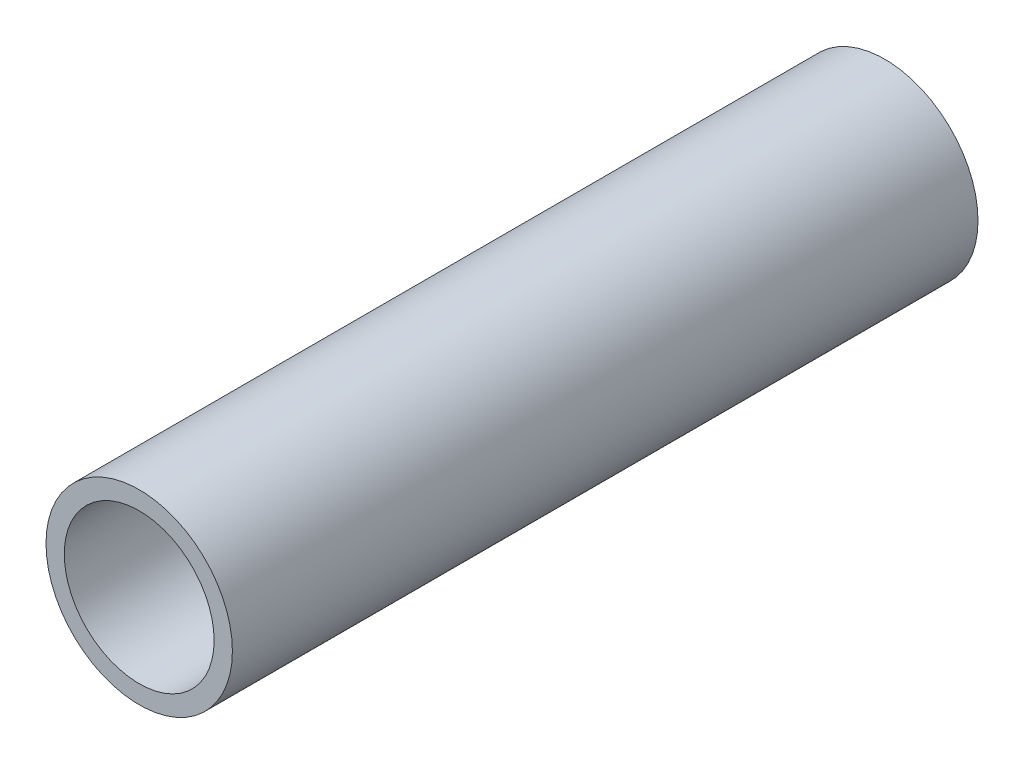
ISO-10303-21;
HEADER;
FILE_DESCRIPTION(('STEP AP214'),'2;1');
FILE_NAME('part.step','',(''),(''),'','','');
FILE_SCHEMA(('AUTOMOTIVE_DESIGN { 1 0 10303 214 1 1 1 1 }'));
ENDSEC;
DATA;
#1=APPLICATION_CONTEXT('core data for automotive mechanical design processes');
#2=APPLICATION_PROTOCOL_DEFINITION('international standard','automotive_design',2000,#1);
#3=PRODUCT_CONTEXT('',#1,'mechanical');
#4=PRODUCT('Part','Part','',(#3));
#5=PRODUCT_RELATED_PRODUCT_CATEGORY('part','',(#4));
#6=PRODUCT_DEFINITION_FORMATION('','',#4);
#7=PRODUCT_DEFINITION_CONTEXT('part definition',#1,'design');
#8=PRODUCT_DEFINITION('design','',#6,#7);
#9=PRODUCT_DEFINITION_SHAPE('','',#8);
#10=(LENGTH_UNIT() NAMED_UNIT(*) SI_UNIT(.MILLI.,.METRE.));
#11=(NAMED_UNIT(*) PLANE_ANGLE_UNIT() SI_UNIT($,.RADIAN.));
#12=(NAMED_UNIT(*) SI_UNIT($,.STERADIAN.) SOLID_ANGLE_UNIT());
#13=UNCERTAINTY_MEASURE_WITH_UNIT(LENGTH_MEASURE(1.E-05),#10,'distance_accuracy_value','');
#14=(GEOMETRIC_REPRESENTATION_CONTEXT(3) GLOBAL_UNCERTAINTY_ASSIGNED_CONTEXT((#13)) GLOBAL_UNIT_ASSIGNED_CONTEXT((#10,
#11,#12)) REPRESENTATION_CONTEXT('',''));
#15=CARTESIAN_POINT('',(0.,0.,0.));
#16=DIRECTION('',(0.,0.,1.));
#17=DIRECTION('',(1.,0.,0.));
#18=AXIS2_PLACEMENT_3D('',#15,#16,#17);
#19=CARTESIAN_POINT('',(0.,0.,50.8));
#20=DIRECTION('',(0.,0.,1.));
#21=DIRECTION('',(1.,0.,0.));
#22=AXIS2_PLACEMENT_3D('',#19,#20,#21);
#23=PLANE('',#22);
#24=CARTESIAN_POINT('',(0.,0.,50.8));
#25=DIRECTION('',(0.,0.,1.));
#26=DIRECTION('',(1.,0.,0.));
#27=AXIS2_PLACEMENT_3D('',#24,#25,#26);
#28=CIRCLE('',#27,6.35);
#29=CARTESIAN_POINT('',(6.35,0.,50.8));
#30=VERTEX_POINT('',#29);
#31=EDGE_CURVE('E10',#30,#30,#28,.T.);
#32=ORIENTED_EDGE('',*,*,#31,.T.);
#33=EDGE_LOOP('',(#32));
#34=FACE_BOUND('',#33,.T.);
#35=CARTESIAN_POINT('',(0.,0.,50.8));
#36=DIRECTION('',(0.,0.,1.));
#37=DIRECTION('',(1.,0.,0.));
#38=AXIS2_PLACEMENT_3D('',#35,#36,#37);
#39=CIRCLE('',#38,5.1054);
#40=CARTESIAN_POINT('',(5.1054,0.,50.8));
#41=VERTEX_POINT('',#40);
#42=EDGE_CURVE('E48',#41,#41,#39,.T.);
#43=ORIENTED_EDGE('',*,*,#42,.F.);
#44=EDGE_LOOP('',(#43));
#45=FACE_BOUND('',#44,.T.);
#46=ADVANCED_FACE('F37',(#34,#45),#23,.T.);
#47=CARTESIAN_POINT('',(0.,0.,0.));
#48=DIRECTION('',(0.,0.,1.));
#49=DIRECTION('',(1.,0.,0.));
#50=AXIS2_PLACEMENT_3D('',#47,#48,#49);
#51=PLANE('',#50);
#52=CARTESIAN_POINT('',(0.,0.,0.));
#53=DIRECTION('',(0.,0.,1.));
#54=DIRECTION('',(1.,0.,0.));
#55=AXIS2_PLACEMENT_3D('',#52,#53,#54);
#56=CIRCLE('',#55,6.35);
#57=CARTESIAN_POINT('',(6.35,0.,0.));
#58=VERTEX_POINT('',#57);
#59=EDGE_CURVE('E41',#58,#58,#56,.T.);
#60=ORIENTED_EDGE('',*,*,#59,.F.);
#61=EDGE_LOOP('',(#60));
#62=FACE_BOUND('',#61,.T.);
#63=CARTESIAN_POINT('',(0.,0.,0.));
#64=DIRECTION('',(0.,0.,1.));
#65=DIRECTION('',(1.,0.,0.));
#66=AXIS2_PLACEMENT_3D('',#63,#64,#65);
#67=CIRCLE('',#66,5.1054);
#68=CARTESIAN_POINT('',(5.1054,0.,0.));
#69=VERTEX_POINT('',#68);
#70=EDGE_CURVE('E50',#69,#69,#67,.T.);
#71=ORIENTED_EDGE('',*,*,#70,.T.);
#72=EDGE_LOOP('',(#71));
#73=FACE_BOUND('',#72,.T.);
#74=ADVANCED_FACE('F60',(#62,#73),#51,.F.);
#75=CARTESIAN_POINT('',(0.,0.,50.8));
#76=DIRECTION('',(0.,0.,-1.));
#77=DIRECTION('',(-1.,0.,0.));
#78=AXIS2_PLACEMENT_3D('',#75,#76,#77);
#79=CYLINDRICAL_SURFACE('',#78,6.35);
#80=ORIENTED_EDGE('',*,*,#31,.F.);
#81=EDGE_LOOP('',(#80));
#82=FACE_BOUND('',#81,.T.);
#83=ORIENTED_EDGE('',*,*,#59,.T.);
#84=EDGE_LOOP('',(#83));
#85=FACE_BOUND('',#84,.T.);
#86=ADVANCED_FACE('F39',(#82,#85),#79,.T.);
#87=CARTESIAN_POINT('',(0.,0.,50.8));
#88=DIRECTION('',(0.,0.,-1.));
#89=DIRECTION('',(-1.,0.,0.));
#90=AXIS2_PLACEMENT_3D('',#87,#88,#89);
#91=CYLINDRICAL_SURFACE('',#90,5.1054);
#92=ORIENTED_EDGE('',*,*,#42,.T.);
#93=EDGE_LOOP('',(#92));
#94=FACE_BOUND('',#93,.T.);
#95=ORIENTED_EDGE('',*,*,#70,.F.);
#96=EDGE_LOOP('',(#95));
#97=FACE_BOUND('',#96,.T.);
#98=ADVANCED_FACE('F56',(#94,#97),#91,.F.);
#99=CLOSED_SHELL('',(#46,#74,#86,#98));
#100=MANIFOLD_SOLID_BREP('B2',#99);
#101=ADVANCED_BREP_SHAPE_REPRESENTATION('',(#18,#100),#14);
#102=SHAPE_DEFINITION_REPRESENTATION(#9,#101);
ENDSEC;
END-ISO-10303-21;
